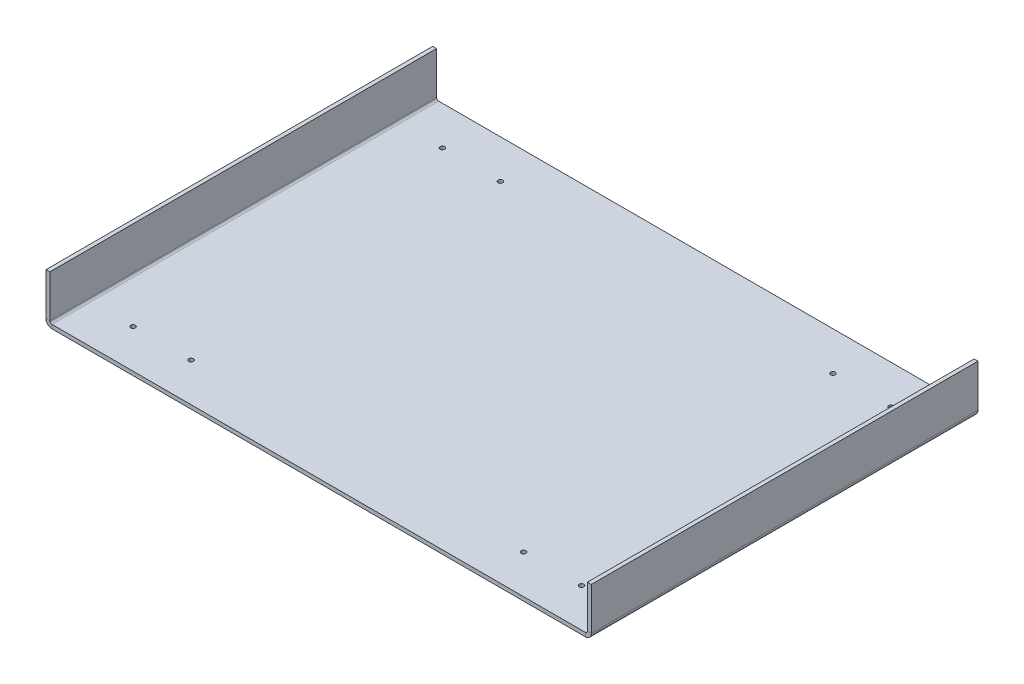
ISO-10303-21;
HEADER;
FILE_DESCRIPTION(('STEP AP214'),'2;1');
FILE_NAME('part.step','',(''),(''),'','','');
FILE_SCHEMA(('AUTOMOTIVE_DESIGN { 1 0 10303 214 1 1 1 1 }'));
ENDSEC;
DATA;
#1=APPLICATION_CONTEXT('core data for automotive mechanical design processes');
#2=APPLICATION_PROTOCOL_DEFINITION('international standard','automotive_design',2000,#1);
#3=PRODUCT_CONTEXT('',#1,'mechanical');
#4=PRODUCT('Part','Part','',(#3));
#5=PRODUCT_RELATED_PRODUCT_CATEGORY('part','',(#4));
#6=PRODUCT_DEFINITION_FORMATION('','',#4);
#7=PRODUCT_DEFINITION_CONTEXT('part definition',#1,'design');
#8=PRODUCT_DEFINITION('design','',#6,#7);
#9=PRODUCT_DEFINITION_SHAPE('','',#8);
#10=(LENGTH_UNIT() NAMED_UNIT(*) SI_UNIT(.MILLI.,.METRE.));
#11=(NAMED_UNIT(*) PLANE_ANGLE_UNIT() SI_UNIT($,.RADIAN.));
#12=(NAMED_UNIT(*) SI_UNIT($,.STERADIAN.) SOLID_ANGLE_UNIT());
#13=UNCERTAINTY_MEASURE_WITH_UNIT(LENGTH_MEASURE(1.E-05),#10,'distance_accuracy_value','');
#14=(GEOMETRIC_REPRESENTATION_CONTEXT(3) GLOBAL_UNCERTAINTY_ASSIGNED_CONTEXT((#13)) GLOBAL_UNIT_ASSIGNED_CONTEXT((#10,
#11,#12)) REPRESENTATION_CONTEXT('',''));
#15=CARTESIAN_POINT('',(0.,0.,0.));
#16=DIRECTION('',(0.,0.,1.));
#17=DIRECTION('',(1.,0.,0.));
#18=AXIS2_PLACEMENT_3D('',#15,#16,#17);
#19=CARTESIAN_POINT('',(0.,-4.,0.));
#20=DIRECTION('',(0.,-1.,0.));
#21=DIRECTION('',(0.,0.,-1.));
#22=AXIS2_PLACEMENT_3D('',#19,#20,#21);
#23=PLANE('',#22);
#24=CARTESIAN_POINT('',(232.,-4.,160.));
#25=DIRECTION('',(0.,-1.,0.));
#26=DIRECTION('',(0.,0.,-1.));
#27=AXIS2_PLACEMENT_3D('',#24,#25,#26);
#28=CIRCLE('',#27,2.4);
#29=CARTESIAN_POINT('',(232.,-4.,157.6));
#30=VERTEX_POINT('',#29);
#31=EDGE_CURVE('E540',#30,#30,#28,.T.);
#32=ORIENTED_EDGE('',*,*,#31,.F.);
#33=EDGE_LOOP('',(#32));
#34=FACE_BOUND('',#33,.T.);
#35=CARTESIAN_POINT('',(172.,-4.,160.));
#36=DIRECTION('',(0.,-1.,0.));
#37=DIRECTION('',(0.,0.,-1.));
#38=AXIS2_PLACEMENT_3D('',#35,#36,#37);
#39=CIRCLE('',#38,2.4);
#40=CARTESIAN_POINT('',(172.,-4.,157.6));
#41=VERTEX_POINT('',#40);
#42=EDGE_CURVE('E544',#41,#41,#39,.T.);
#43=ORIENTED_EDGE('',*,*,#42,.F.);
#44=EDGE_LOOP('',(#43));
#45=FACE_BOUND('',#44,.T.);
#46=CARTESIAN_POINT('',(-172.,-4.,160.));
#47=DIRECTION('',(0.,-1.,0.));
#48=DIRECTION('',(0.,0.,-1.));
#49=AXIS2_PLACEMENT_3D('',#46,#47,#48);
#50=CIRCLE('',#49,2.4);
#51=CARTESIAN_POINT('',(-172.,-4.,157.6));
#52=VERTEX_POINT('',#51);
#53=EDGE_CURVE('E553',#52,#52,#50,.T.);
#54=ORIENTED_EDGE('',*,*,#53,.F.);
#55=EDGE_LOOP('',(#54));
#56=FACE_BOUND('',#55,.T.);
#57=CARTESIAN_POINT('',(-232.,-4.,160.));
#58=DIRECTION('',(0.,-1.,0.));
#59=DIRECTION('',(0.,0.,-1.));
#60=AXIS2_PLACEMENT_3D('',#57,#58,#59);
#61=CIRCLE('',#60,2.4);
#62=CARTESIAN_POINT('',(-232.,-4.,157.6));
#63=VERTEX_POINT('',#62);
#64=EDGE_CURVE('E559',#63,#63,#61,.T.);
#65=ORIENTED_EDGE('',*,*,#64,.F.);
#66=EDGE_LOOP('',(#65));
#67=FACE_BOUND('',#66,.T.);
#68=CARTESIAN_POINT('',(232.,-4.,-160.));
#69=DIRECTION('',(0.,-1.,0.));
#70=DIRECTION('',(0.,0.,-1.));
#71=AXIS2_PLACEMENT_3D('',#68,#69,#70);
#72=CIRCLE('',#71,2.4);
#73=CARTESIAN_POINT('',(232.,-4.,-162.4));
#74=VERTEX_POINT('',#73);
#75=EDGE_CURVE('E565',#74,#74,#72,.T.);
#76=ORIENTED_EDGE('',*,*,#75,.F.);
#77=EDGE_LOOP('',(#76));
#78=FACE_BOUND('',#77,.T.);
#79=CARTESIAN_POINT('',(172.,-4.,-160.));
#80=DIRECTION('',(0.,-1.,0.));
#81=DIRECTION('',(0.,0.,-1.));
#82=AXIS2_PLACEMENT_3D('',#79,#80,#81);
#83=CIRCLE('',#82,2.4);
#84=CARTESIAN_POINT('',(172.,-4.,-162.4));
#85=VERTEX_POINT('',#84);
#86=EDGE_CURVE('E571',#85,#85,#83,.T.);
#87=ORIENTED_EDGE('',*,*,#86,.F.);
#88=EDGE_LOOP('',(#87));
#89=FACE_BOUND('',#88,.T.);
#90=CARTESIAN_POINT('',(-172.,-4.,-160.));
#91=DIRECTION('',(0.,-1.,0.));
#92=DIRECTION('',(0.,0.,-1.));
#93=AXIS2_PLACEMENT_3D('',#90,#91,#92);
#94=CIRCLE('',#93,2.4);
#95=CARTESIAN_POINT('',(-172.,-4.,-162.4));
#96=VERTEX_POINT('',#95);
#97=EDGE_CURVE('E577',#96,#96,#94,.T.);
#98=ORIENTED_EDGE('',*,*,#97,.F.);
#99=EDGE_LOOP('',(#98));
#100=FACE_BOUND('',#99,.T.);
#101=CARTESIAN_POINT('',(-232.,-4.,-160.));
#102=DIRECTION('',(0.,-1.,0.));
#103=DIRECTION('',(0.,0.,-1.));
#104=AXIS2_PLACEMENT_3D('',#101,#102,#103);
#105=CIRCLE('',#104,2.4);
#106=CARTESIAN_POINT('',(-232.,-4.,-162.4));
#107=VERTEX_POINT('',#106);
#108=EDGE_CURVE('E583',#107,#107,#105,.T.);
#109=ORIENTED_EDGE('',*,*,#108,.F.);
#110=EDGE_LOOP('',(#109));
#111=FACE_BOUND('',#110,.T.);
#112=DIRECTION('',(-1.,0.,0.));
#113=VECTOR('',#112,1.);
#114=CARTESIAN_POINT('',(-282.,-4.,-200.));
#115=LINE('',#114,#113);
#116=CARTESIAN_POINT('',(276.,-4.,-200.));
#117=VERTEX_POINT('',#116);
#118=CARTESIAN_POINT('',(-276.,-4.,-200.));
#119=VERTEX_POINT('',#118);
#120=EDGE_CURVE('E26',#117,#119,#115,.T.);
#121=ORIENTED_EDGE('',*,*,#120,.F.);
#122=DIRECTION('',(0.,0.,-1.));
#123=VECTOR('',#122,1.);
#124=CARTESIAN_POINT('',(276.,-4.,-200.));
#125=LINE('',#124,#123);
#126=CARTESIAN_POINT('',(276.,-4.,200.));
#127=VERTEX_POINT('',#126);
#128=EDGE_CURVE('E150',#117,#127,#125,.F.);
#129=ORIENTED_EDGE('',*,*,#128,.T.);
#130=DIRECTION('',(1.,0.,0.));
#131=VECTOR('',#130,1.);
#132=CARTESIAN_POINT('',(-282.,-4.,200.));
#133=LINE('',#132,#131);
#134=CARTESIAN_POINT('',(-276.,-4.,200.));
#135=VERTEX_POINT('',#134);
#136=EDGE_CURVE('E11',#135,#127,#133,.T.);
#137=ORIENTED_EDGE('',*,*,#136,.F.);
#138=DIRECTION('',(0.,0.,1.));
#139=VECTOR('',#138,1.);
#140=CARTESIAN_POINT('',(-276.,-4.,200.));
#141=LINE('',#140,#139);
#142=EDGE_CURVE('E201',#135,#119,#141,.F.);
#143=ORIENTED_EDGE('',*,*,#142,.T.);
#144=EDGE_LOOP('',(#121,#129,#137,#143));
#145=FACE_BOUND('',#144,.T.);
#146=ADVANCED_FACE('F17',(#34,#45,#56,#67,#78,#89,#100,#111,#145),#23,.T.);
#147=CARTESIAN_POINT('',(0.,0.,0.));
#148=DIRECTION('',(0.,-1.,0.));
#149=DIRECTION('',(0.,0.,-1.));
#150=AXIS2_PLACEMENT_3D('',#147,#148,#149);
#151=PLANE('',#150);
#152=CARTESIAN_POINT('',(232.,0.,160.));
#153=DIRECTION('',(0.,-1.,0.));
#154=DIRECTION('',(0.,0.,-1.));
#155=AXIS2_PLACEMENT_3D('',#152,#153,#154);
#156=CIRCLE('',#155,2.4);
#157=CARTESIAN_POINT('',(232.,0.,157.6));
#158=VERTEX_POINT('',#157);
#159=EDGE_CURVE('E543',#158,#158,#156,.T.);
#160=ORIENTED_EDGE('',*,*,#159,.T.);
#161=EDGE_LOOP('',(#160));
#162=FACE_BOUND('',#161,.T.);
#163=CARTESIAN_POINT('',(172.,0.,160.));
#164=DIRECTION('',(0.,-1.,0.));
#165=DIRECTION('',(0.,0.,-1.));
#166=AXIS2_PLACEMENT_3D('',#163,#164,#165);
#167=CIRCLE('',#166,2.4);
#168=CARTESIAN_POINT('',(172.,0.,157.6));
#169=VERTEX_POINT('',#168);
#170=EDGE_CURVE('E547',#169,#169,#167,.T.);
#171=ORIENTED_EDGE('',*,*,#170,.T.);
#172=EDGE_LOOP('',(#171));
#173=FACE_BOUND('',#172,.T.);
#174=CARTESIAN_POINT('',(-172.,0.,160.));
#175=DIRECTION('',(0.,-1.,0.));
#176=DIRECTION('',(0.,0.,-1.));
#177=AXIS2_PLACEMENT_3D('',#174,#175,#176);
#178=CIRCLE('',#177,2.4);
#179=CARTESIAN_POINT('',(-172.,0.,157.6));
#180=VERTEX_POINT('',#179);
#181=EDGE_CURVE('E556',#180,#180,#178,.T.);
#182=ORIENTED_EDGE('',*,*,#181,.T.);
#183=EDGE_LOOP('',(#182));
#184=FACE_BOUND('',#183,.T.);
#185=CARTESIAN_POINT('',(-232.,0.,160.));
#186=DIRECTION('',(0.,-1.,0.));
#187=DIRECTION('',(0.,0.,-1.));
#188=AXIS2_PLACEMENT_3D('',#185,#186,#187);
#189=CIRCLE('',#188,2.4);
#190=CARTESIAN_POINT('',(-232.,0.,157.6));
#191=VERTEX_POINT('',#190);
#192=EDGE_CURVE('E562',#191,#191,#189,.T.);
#193=ORIENTED_EDGE('',*,*,#192,.T.);
#194=EDGE_LOOP('',(#193));
#195=FACE_BOUND('',#194,.T.);
#196=CARTESIAN_POINT('',(232.,0.,-160.));
#197=DIRECTION('',(0.,-1.,0.));
#198=DIRECTION('',(0.,0.,-1.));
#199=AXIS2_PLACEMENT_3D('',#196,#197,#198);
#200=CIRCLE('',#199,2.4);
#201=CARTESIAN_POINT('',(232.,0.,-162.4));
#202=VERTEX_POINT('',#201);
#203=EDGE_CURVE('E568',#202,#202,#200,.T.);
#204=ORIENTED_EDGE('',*,*,#203,.T.);
#205=EDGE_LOOP('',(#204));
#206=FACE_BOUND('',#205,.T.);
#207=CARTESIAN_POINT('',(172.,0.,-160.));
#208=DIRECTION('',(0.,-1.,0.));
#209=DIRECTION('',(0.,0.,-1.));
#210=AXIS2_PLACEMENT_3D('',#207,#208,#209);
#211=CIRCLE('',#210,2.4);
#212=CARTESIAN_POINT('',(172.,0.,-162.4));
#213=VERTEX_POINT('',#212);
#214=EDGE_CURVE('E574',#213,#213,#211,.T.);
#215=ORIENTED_EDGE('',*,*,#214,.T.);
#216=EDGE_LOOP('',(#215));
#217=FACE_BOUND('',#216,.T.);
#218=CARTESIAN_POINT('',(-172.,0.,-160.));
#219=DIRECTION('',(0.,-1.,0.));
#220=DIRECTION('',(0.,0.,-1.));
#221=AXIS2_PLACEMENT_3D('',#218,#219,#220);
#222=CIRCLE('',#221,2.4);
#223=CARTESIAN_POINT('',(-172.,0.,-162.4));
#224=VERTEX_POINT('',#223);
#225=EDGE_CURVE('E580',#224,#224,#222,.T.);
#226=ORIENTED_EDGE('',*,*,#225,.T.);
#227=EDGE_LOOP('',(#226));
#228=FACE_BOUND('',#227,.T.);
#229=CARTESIAN_POINT('',(-232.,0.,-160.));
#230=DIRECTION('',(0.,-1.,0.));
#231=DIRECTION('',(0.,0.,-1.));
#232=AXIS2_PLACEMENT_3D('',#229,#230,#231);
#233=CIRCLE('',#232,2.4);
#234=CARTESIAN_POINT('',(-232.,0.,-162.4));
#235=VERTEX_POINT('',#234);
#236=EDGE_CURVE('E149',#235,#235,#233,.T.);
#237=ORIENTED_EDGE('',*,*,#236,.T.);
#238=EDGE_LOOP('',(#237));
#239=FACE_BOUND('',#238,.T.);
#240=DIRECTION('',(0.,0.,-1.));
#241=VECTOR('',#240,1.);
#242=CARTESIAN_POINT('',(276.,0.,-200.));
#243=LINE('',#242,#241);
#244=CARTESIAN_POINT('',(276.,0.,-200.));
#245=VERTEX_POINT('',#244);
#246=CARTESIAN_POINT('',(276.,0.,200.));
#247=VERTEX_POINT('',#246);
#248=EDGE_CURVE('E161',#245,#247,#243,.F.);
#249=ORIENTED_EDGE('',*,*,#248,.F.);
#250=DIRECTION('',(-1.,0.,0.));
#251=VECTOR('',#250,1.);
#252=CARTESIAN_POINT('',(-282.,0.,-200.));
#253=LINE('',#252,#251);
#254=CARTESIAN_POINT('',(-276.,0.,-200.));
#255=VERTEX_POINT('',#254);
#256=EDGE_CURVE('E218',#245,#255,#253,.T.);
#257=ORIENTED_EDGE('',*,*,#256,.T.);
#258=DIRECTION('',(0.,0.,1.));
#259=VECTOR('',#258,1.);
#260=CARTESIAN_POINT('',(-276.,0.,200.));
#261=LINE('',#260,#259);
#262=CARTESIAN_POINT('',(-276.,0.,200.));
#263=VERTEX_POINT('',#262);
#264=EDGE_CURVE('E212',#263,#255,#261,.F.);
#265=ORIENTED_EDGE('',*,*,#264,.F.);
#266=DIRECTION('',(1.,0.,0.));
#267=VECTOR('',#266,1.);
#268=CARTESIAN_POINT('',(-282.,0.,200.));
#269=LINE('',#268,#267);
#270=EDGE_CURVE('E21',#263,#247,#269,.T.);
#271=ORIENTED_EDGE('',*,*,#270,.T.);
#272=EDGE_LOOP('',(#249,#257,#265,#271));
#273=FACE_BOUND('',#272,.T.);
#274=ADVANCED_FACE('F230',(#162,#173,#184,#195,#206,#217,#228,#239,#273),#151,.F.);
#275=CARTESIAN_POINT('',(-282.,-4.,-200.));
#276=DIRECTION('',(0.,0.,-1.));
#277=DIRECTION('',(-1.,0.,0.));
#278=AXIS2_PLACEMENT_3D('',#275,#276,#277);
#279=PLANE('',#278);
#280=ORIENTED_EDGE('',*,*,#256,.F.);
#281=DIRECTION('',(0.,-1.,0.));
#282=VECTOR('',#281,1.);
#283=CARTESIAN_POINT('',(276.,0.,-200.));
#284=LINE('',#283,#282);
#285=EDGE_CURVE('E155',#245,#117,#284,.T.);
#286=ORIENTED_EDGE('',*,*,#285,.T.);
#287=ORIENTED_EDGE('',*,*,#120,.T.);
#288=DIRECTION('',(0.,-1.,0.));
#289=VECTOR('',#288,1.);
#290=CARTESIAN_POINT('',(-276.,0.,-200.));
#291=LINE('',#290,#289);
#292=EDGE_CURVE('E216',#255,#119,#291,.T.);
#293=ORIENTED_EDGE('',*,*,#292,.F.);
#294=EDGE_LOOP('',(#280,#286,#287,#293));
#295=FACE_BOUND('',#294,.T.);
#296=ADVANCED_FACE('F19',(#295),#279,.T.);
#297=CARTESIAN_POINT('',(-282.,-4.,200.));
#298=DIRECTION('',(0.,0.,1.));
#299=DIRECTION('',(1.,0.,0.));
#300=AXIS2_PLACEMENT_3D('',#297,#298,#299);
#301=PLANE('',#300);
#302=DIRECTION('',(0.,-1.,0.));
#303=VECTOR('',#302,1.);
#304=CARTESIAN_POINT('',(276.,0.,200.));
#305=LINE('',#304,#303);
#306=EDGE_CURVE('E166',#247,#127,#305,.T.);
#307=ORIENTED_EDGE('',*,*,#306,.F.);
#308=ORIENTED_EDGE('',*,*,#270,.F.);
#309=DIRECTION('',(0.,-1.,0.));
#310=VECTOR('',#309,1.);
#311=CARTESIAN_POINT('',(-276.,0.,200.));
#312=LINE('',#311,#310);
#313=EDGE_CURVE('E206',#263,#135,#312,.T.);
#314=ORIENTED_EDGE('',*,*,#313,.T.);
#315=ORIENTED_EDGE('',*,*,#136,.T.);
#316=EDGE_LOOP('',(#307,#308,#314,#315));
#317=FACE_BOUND('',#316,.T.);
#318=ADVANCED_FACE('F233',(#317),#301,.T.);
#319=CARTESIAN_POINT('',(-276.,2.,-200.));
#320=DIRECTION('',(0.,0.,-1.));
#321=DIRECTION('',(-1.,0.,0.));
#322=AXIS2_PLACEMENT_3D('',#319,#320,#321);
#323=PLANE('',#322);
#324=DIRECTION('',(1.,0.,0.));
#325=VECTOR('',#324,1.);
#326=CARTESIAN_POINT('',(-282.,2.,-200.));
#327=LINE('',#326,#325);
#328=CARTESIAN_POINT('',(-278.,2.,-200.));
#329=VERTEX_POINT('',#328);
#330=CARTESIAN_POINT('',(-282.,2.,-200.));
#331=VERTEX_POINT('',#330);
#332=EDGE_CURVE('E168',#329,#331,#327,.F.);
#333=ORIENTED_EDGE('',*,*,#332,.F.);
#334=CARTESIAN_POINT('',(-276.,2.,-200.));
#335=DIRECTION('',(0.,0.,1.));
#336=DIRECTION('',(1.,0.,0.));
#337=AXIS2_PLACEMENT_3D('',#334,#335,#336);
#338=CIRCLE('',#337,2.);
#339=EDGE_CURVE('E209',#255,#329,#338,.F.);
#340=ORIENTED_EDGE('',*,*,#339,.F.);
#341=ORIENTED_EDGE('',*,*,#292,.T.);
#342=CARTESIAN_POINT('',(-276.,2.,-200.));
#343=DIRECTION('',(0.,0.,1.));
#344=DIRECTION('',(1.,0.,0.));
#345=AXIS2_PLACEMENT_3D('',#342,#343,#344);
#346=CIRCLE('',#345,6.);
#347=EDGE_CURVE('E34',#119,#331,#346,.F.);
#348=ORIENTED_EDGE('',*,*,#347,.T.);
#349=EDGE_LOOP('',(#333,#340,#341,#348));
#350=FACE_BOUND('',#349,.T.);
#351=ADVANCED_FACE('F248',(#350),#323,.T.);
#352=CARTESIAN_POINT('',(-276.,2.,200.));
#353=DIRECTION('',(0.,0.,-1.));
#354=DIRECTION('',(-1.,0.,0.));
#355=AXIS2_PLACEMENT_3D('',#352,#353,#354);
#356=PLANE('',#355);
#357=CARTESIAN_POINT('',(-276.,2.,200.));
#358=DIRECTION('',(0.,0.,1.));
#359=DIRECTION('',(1.,0.,0.));
#360=AXIS2_PLACEMENT_3D('',#357,#358,#359);
#361=CIRCLE('',#360,2.);
#362=CARTESIAN_POINT('',(-278.,2.,200.));
#363=VERTEX_POINT('',#362);
#364=EDGE_CURVE('E174',#363,#263,#361,.T.);
#365=ORIENTED_EDGE('',*,*,#364,.F.);
#366=DIRECTION('',(1.,0.,0.));
#367=VECTOR('',#366,1.);
#368=CARTESIAN_POINT('',(-278.,2.,200.));
#369=LINE('',#368,#367);
#370=CARTESIAN_POINT('',(-282.,2.,200.));
#371=VERTEX_POINT('',#370);
#372=EDGE_CURVE('E194',#363,#371,#369,.F.);
#373=ORIENTED_EDGE('',*,*,#372,.T.);
#374=CARTESIAN_POINT('',(-276.,2.,200.));
#375=DIRECTION('',(0.,0.,1.));
#376=DIRECTION('',(1.,0.,0.));
#377=AXIS2_PLACEMENT_3D('',#374,#375,#376);
#378=CIRCLE('',#377,6.);
#379=EDGE_CURVE('E204',#371,#135,#378,.T.);
#380=ORIENTED_EDGE('',*,*,#379,.T.);
#381=ORIENTED_EDGE('',*,*,#313,.F.);
#382=EDGE_LOOP('',(#365,#373,#380,#381));
#383=FACE_BOUND('',#382,.T.);
#384=ADVANCED_FACE('F272',(#383),#356,.F.);
#385=CARTESIAN_POINT('',(-276.,2.,200.));
#386=DIRECTION('',(0.,0.,1.));
#387=DIRECTION('',(-1.,0.,0.));
#388=AXIS2_PLACEMENT_3D('',#385,#386,#387);
#389=CYLINDRICAL_SURFACE('',#388,6.);
#390=ORIENTED_EDGE('',*,*,#142,.F.);
#391=ORIENTED_EDGE('',*,*,#379,.F.);
#392=DIRECTION('',(0.,0.,1.));
#393=VECTOR('',#392,1.);
#394=CARTESIAN_POINT('',(-282.,2.,-200.));
#395=LINE('',#394,#393);
#396=EDGE_CURVE('E192',#371,#331,#395,.F.);
#397=ORIENTED_EDGE('',*,*,#396,.T.);
#398=ORIENTED_EDGE('',*,*,#347,.F.);
#399=EDGE_LOOP('',(#390,#391,#397,#398));
#400=FACE_BOUND('',#399,.T.);
#401=ADVANCED_FACE('F275',(#400),#389,.T.);
#402=CARTESIAN_POINT('',(-276.,2.,200.));
#403=DIRECTION('',(0.,0.,1.));
#404=DIRECTION('',(-1.,0.,0.));
#405=AXIS2_PLACEMENT_3D('',#402,#403,#404);
#406=CYLINDRICAL_SURFACE('',#405,2.);
#407=ORIENTED_EDGE('',*,*,#264,.T.);
#408=ORIENTED_EDGE('',*,*,#339,.T.);
#409=DIRECTION('',(0.,0.,1.));
#410=VECTOR('',#409,1.);
#411=CARTESIAN_POINT('',(-278.,2.,-200.));
#412=LINE('',#411,#410);
#413=EDGE_CURVE('E197',#329,#363,#412,.T.);
#414=ORIENTED_EDGE('',*,*,#413,.T.);
#415=ORIENTED_EDGE('',*,*,#364,.T.);
#416=EDGE_LOOP('',(#407,#408,#414,#415));
#417=FACE_BOUND('',#416,.T.);
#418=ADVANCED_FACE('F251',(#417),#406,.F.);
#419=CARTESIAN_POINT('',(-282.,46.,200.));
#420=DIRECTION('',(0.,0.,-1.));
#421=DIRECTION('',(0.,1.,0.));
#422=AXIS2_PLACEMENT_3D('',#419,#420,#421);
#423=PLANE('',#422);
#424=ORIENTED_EDGE('',*,*,#372,.F.);
#425=DIRECTION('',(0.,-1.,0.));
#426=VECTOR('',#425,1.);
#427=CARTESIAN_POINT('',(-278.,46.,200.));
#428=LINE('',#427,#426);
#429=CARTESIAN_POINT('',(-278.,46.,200.));
#430=VERTEX_POINT('',#429);
#431=EDGE_CURVE('E190',#363,#430,#428,.F.);
#432=ORIENTED_EDGE('',*,*,#431,.T.);
#433=DIRECTION('',(1.,0.,0.));
#434=VECTOR('',#433,1.);
#435=CARTESIAN_POINT('',(-282.,46.,200.));
#436=LINE('',#435,#434);
#437=CARTESIAN_POINT('',(-282.,46.,200.));
#438=VERTEX_POINT('',#437);
#439=EDGE_CURVE('E171',#438,#430,#436,.T.);
#440=ORIENTED_EDGE('',*,*,#439,.F.);
#441=DIRECTION('',(0.,1.,0.));
#442=VECTOR('',#441,1.);
#443=CARTESIAN_POINT('',(-282.,-1.15556481806776E-12,200.));
#444=LINE('',#443,#442);
#445=EDGE_CURVE('E183',#371,#438,#444,.T.);
#446=ORIENTED_EDGE('',*,*,#445,.F.);
#447=EDGE_LOOP('',(#424,#432,#440,#446));
#448=FACE_BOUND('',#447,.T.);
#449=ADVANCED_FACE('F269',(#448),#423,.F.);
#450=CARTESIAN_POINT('',(-282.,0.,-200.));
#451=DIRECTION('',(0.,0.,1.));
#452=DIRECTION('',(0.,-1.,0.));
#453=AXIS2_PLACEMENT_3D('',#450,#451,#452);
#454=PLANE('',#453);
#455=ORIENTED_EDGE('',*,*,#332,.T.);
#456=DIRECTION('',(0.,-1.,0.));
#457=VECTOR('',#456,1.);
#458=CARTESIAN_POINT('',(-282.,-9.1421198662751E-13,-200.));
#459=LINE('',#458,#457);
#460=CARTESIAN_POINT('',(-282.,46.,-200.));
#461=VERTEX_POINT('',#460);
#462=EDGE_CURVE('E178',#461,#331,#459,.T.);
#463=ORIENTED_EDGE('',*,*,#462,.F.);
#464=DIRECTION('',(1.,0.,0.));
#465=VECTOR('',#464,1.);
#466=CARTESIAN_POINT('',(-282.,46.,-200.));
#467=LINE('',#466,#465);
#468=CARTESIAN_POINT('',(-278.,46.,-200.));
#469=VERTEX_POINT('',#468);
#470=EDGE_CURVE('E175',#461,#469,#467,.T.);
#471=ORIENTED_EDGE('',*,*,#470,.T.);
#472=DIRECTION('',(0.,1.,0.));
#473=VECTOR('',#472,1.);
#474=CARTESIAN_POINT('',(-278.,0.,-200.));
#475=LINE('',#474,#473);
#476=EDGE_CURVE('E185',#469,#329,#475,.F.);
#477=ORIENTED_EDGE('',*,*,#476,.T.);
#478=EDGE_LOOP('',(#455,#463,#471,#477));
#479=FACE_BOUND('',#478,.T.);
#480=ADVANCED_FACE('F259',(#479),#454,.F.);
#481=CARTESIAN_POINT('',(-282.,-1.03488840234764E-12,0.));
#482=DIRECTION('',(1.,0.,0.));
#483=DIRECTION('',(0.,1.,0.));
#484=AXIS2_PLACEMENT_3D('',#481,#482,#483);
#485=PLANE('',#484);
#486=ORIENTED_EDGE('',*,*,#396,.F.);
#487=ORIENTED_EDGE('',*,*,#445,.T.);
#488=DIRECTION('',(0.,0.,-1.));
#489=VECTOR('',#488,1.);
#490=CARTESIAN_POINT('',(-282.,46.,0.));
#491=LINE('',#490,#489);
#492=EDGE_CURVE('E181',#438,#461,#491,.T.);
#493=ORIENTED_EDGE('',*,*,#492,.T.);
#494=ORIENTED_EDGE('',*,*,#462,.T.);
#495=EDGE_LOOP('',(#486,#487,#493,#494));
#496=FACE_BOUND('',#495,.T.);
#497=ADVANCED_FACE('F274',(#496),#485,.F.);
#498=CARTESIAN_POINT('',(-278.,-1.02092247699226E-12,0.));
#499=DIRECTION('',(1.,0.,0.));
#500=DIRECTION('',(0.,1.,0.));
#501=AXIS2_PLACEMENT_3D('',#498,#499,#500);
#502=PLANE('',#501);
#503=ORIENTED_EDGE('',*,*,#431,.F.);
#504=ORIENTED_EDGE('',*,*,#413,.F.);
#505=ORIENTED_EDGE('',*,*,#476,.F.);
#506=DIRECTION('',(0.,0.,1.));
#507=VECTOR('',#506,1.);
#508=CARTESIAN_POINT('',(-278.,46.,-200.));
#509=LINE('',#508,#507);
#510=EDGE_CURVE('E188',#430,#469,#509,.F.);
#511=ORIENTED_EDGE('',*,*,#510,.F.);
#512=EDGE_LOOP('',(#503,#504,#505,#511));
#513=FACE_BOUND('',#512,.T.);
#514=ADVANCED_FACE('F256',(#513),#502,.T.);
#515=CARTESIAN_POINT('',(-282.,46.,-200.));
#516=DIRECTION('',(0.,-1.,0.));
#517=DIRECTION('',(1.,0.,0.));
#518=AXIS2_PLACEMENT_3D('',#515,#516,#517);
#519=PLANE('',#518);
#520=ORIENTED_EDGE('',*,*,#510,.T.);
#521=ORIENTED_EDGE('',*,*,#470,.F.);
#522=ORIENTED_EDGE('',*,*,#492,.F.);
#523=ORIENTED_EDGE('',*,*,#439,.T.);
#524=EDGE_LOOP('',(#520,#521,#522,#523));
#525=FACE_BOUND('',#524,.T.);
#526=ADVANCED_FACE('F264',(#525),#519,.F.);
#527=CARTESIAN_POINT('',(276.,2.,200.));
#528=DIRECTION('',(0.,0.,1.));
#529=DIRECTION('',(1.,0.,0.));
#530=AXIS2_PLACEMENT_3D('',#527,#528,#529);
#531=PLANE('',#530);
#532=DIRECTION('',(-1.,0.,0.));
#533=VECTOR('',#532,1.);
#534=CARTESIAN_POINT('',(282.,2.,200.));
#535=LINE('',#534,#533);
#536=CARTESIAN_POINT('',(278.,2.,200.));
#537=VERTEX_POINT('',#536);
#538=CARTESIAN_POINT('',(282.,2.,200.));
#539=VERTEX_POINT('',#538);
#540=EDGE_CURVE('E132',#537,#539,#535,.F.);
#541=ORIENTED_EDGE('',*,*,#540,.F.);
#542=CARTESIAN_POINT('',(276.,2.,200.));
#543=DIRECTION('',(0.,0.,-1.));
#544=DIRECTION('',(-1.,0.,0.));
#545=AXIS2_PLACEMENT_3D('',#542,#543,#544);
#546=CIRCLE('',#545,2.);
#547=EDGE_CURVE('E158',#247,#537,#546,.F.);
#548=ORIENTED_EDGE('',*,*,#547,.F.);
#549=ORIENTED_EDGE('',*,*,#306,.T.);
#550=CARTESIAN_POINT('',(276.,2.,200.));
#551=DIRECTION('',(0.,0.,-1.));
#552=DIRECTION('',(-1.,0.,0.));
#553=AXIS2_PLACEMENT_3D('',#550,#551,#552);
#554=CIRCLE('',#553,6.);
#555=EDGE_CURVE('E42',#127,#539,#554,.F.);
#556=ORIENTED_EDGE('',*,*,#555,.T.);
#557=EDGE_LOOP('',(#541,#548,#549,#556));
#558=FACE_BOUND('',#557,.T.);
#559=ADVANCED_FACE('F237',(#558),#531,.T.);
#560=CARTESIAN_POINT('',(276.,2.,-200.));
#561=DIRECTION('',(0.,0.,1.));
#562=DIRECTION('',(1.,0.,0.));
#563=AXIS2_PLACEMENT_3D('',#560,#561,#562);
#564=PLANE('',#563);
#565=CARTESIAN_POINT('',(276.,2.,-200.));
#566=DIRECTION('',(0.,0.,-1.));
#567=DIRECTION('',(-1.,0.,0.));
#568=AXIS2_PLACEMENT_3D('',#565,#566,#567);
#569=CIRCLE('',#568,2.);
#570=CARTESIAN_POINT('',(278.,2.,-200.));
#571=VERTEX_POINT('',#570);
#572=EDGE_CURVE('E163',#571,#245,#569,.T.);
#573=ORIENTED_EDGE('',*,*,#572,.F.);
#574=DIRECTION('',(-1.,0.,0.));
#575=VECTOR('',#574,1.);
#576=CARTESIAN_POINT('',(278.,2.,-200.));
#577=LINE('',#576,#575);
#578=CARTESIAN_POINT('',(282.,2.,-200.));
#579=VERTEX_POINT('',#578);
#580=EDGE_CURVE('E143',#571,#579,#577,.F.);
#581=ORIENTED_EDGE('',*,*,#580,.T.);
#582=CARTESIAN_POINT('',(276.,2.,-200.));
#583=DIRECTION('',(0.,0.,-1.));
#584=DIRECTION('',(-1.,0.,0.));
#585=AXIS2_PLACEMENT_3D('',#582,#583,#584);
#586=CIRCLE('',#585,6.);
#587=EDGE_CURVE('E153',#579,#117,#586,.T.);
#588=ORIENTED_EDGE('',*,*,#587,.T.);
#589=ORIENTED_EDGE('',*,*,#285,.F.);
#590=EDGE_LOOP('',(#573,#581,#588,#589));
#591=FACE_BOUND('',#590,.T.);
#592=ADVANCED_FACE('F243',(#591),#564,.F.);
#593=CARTESIAN_POINT('',(276.,2.,-200.));
#594=DIRECTION('',(0.,0.,-1.));
#595=DIRECTION('',(1.,0.,0.));
#596=AXIS2_PLACEMENT_3D('',#593,#594,#595);
#597=CYLINDRICAL_SURFACE('',#596,6.);
#598=ORIENTED_EDGE('',*,*,#128,.F.);
#599=ORIENTED_EDGE('',*,*,#587,.F.);
#600=DIRECTION('',(0.,0.,-1.));
#601=VECTOR('',#600,1.);
#602=CARTESIAN_POINT('',(282.,2.,200.));
#603=LINE('',#602,#601);
#604=EDGE_CURVE('E141',#579,#539,#603,.F.);
#605=ORIENTED_EDGE('',*,*,#604,.T.);
#606=ORIENTED_EDGE('',*,*,#555,.F.);
#607=EDGE_LOOP('',(#598,#599,#605,#606));
#608=FACE_BOUND('',#607,.T.);
#609=ADVANCED_FACE('F240',(#608),#597,.T.);
#610=CARTESIAN_POINT('',(276.,2.,-200.));
#611=DIRECTION('',(0.,0.,-1.));
#612=DIRECTION('',(1.,0.,0.));
#613=AXIS2_PLACEMENT_3D('',#610,#611,#612);
#614=CYLINDRICAL_SURFACE('',#613,2.);
#615=ORIENTED_EDGE('',*,*,#248,.T.);
#616=ORIENTED_EDGE('',*,*,#547,.T.);
#617=DIRECTION('',(0.,0.,-1.));
#618=VECTOR('',#617,1.);
#619=CARTESIAN_POINT('',(278.,2.,200.));
#620=LINE('',#619,#618);
#621=EDGE_CURVE('E146',#537,#571,#620,.T.);
#622=ORIENTED_EDGE('',*,*,#621,.T.);
#623=ORIENTED_EDGE('',*,*,#572,.T.);
#624=EDGE_LOOP('',(#615,#616,#622,#623));
#625=FACE_BOUND('',#624,.T.);
#626=ADVANCED_FACE('F402',(#625),#614,.F.);
#627=CARTESIAN_POINT('',(282.,0.,200.));
#628=DIRECTION('',(0.,0.,-1.));
#629=DIRECTION('',(0.,1.,0.));
#630=AXIS2_PLACEMENT_3D('',#627,#628,#629);
#631=PLANE('',#630);
#632=ORIENTED_EDGE('',*,*,#540,.T.);
#633=DIRECTION('',(0.,-1.,0.));
#634=VECTOR('',#633,1.);
#635=CARTESIAN_POINT('',(282.,-1.15556481806776E-12,200.));
#636=LINE('',#635,#634);
#637=CARTESIAN_POINT('',(282.,46.,200.));
#638=VERTEX_POINT('',#637);
#639=EDGE_CURVE('E113',#638,#539,#636,.T.);
#640=ORIENTED_EDGE('',*,*,#639,.F.);
#641=DIRECTION('',(-1.,0.,0.));
#642=VECTOR('',#641,1.);
#643=CARTESIAN_POINT('',(282.,46.,200.));
#644=LINE('',#643,#642);
#645=CARTESIAN_POINT('',(278.,46.,200.));
#646=VERTEX_POINT('',#645);
#647=EDGE_CURVE('E119',#638,#646,#644,.T.);
#648=ORIENTED_EDGE('',*,*,#647,.T.);
#649=DIRECTION('',(0.,1.,0.));
#650=VECTOR('',#649,1.);
#651=CARTESIAN_POINT('',(278.,0.,200.));
#652=LINE('',#651,#650);
#653=EDGE_CURVE('E139',#646,#537,#652,.F.);
#654=ORIENTED_EDGE('',*,*,#653,.T.);
#655=EDGE_LOOP('',(#632,#640,#648,#654));
#656=FACE_BOUND('',#655,.T.);
#657=ADVANCED_FACE('F131',(#656),#631,.F.);
#658=CARTESIAN_POINT('',(282.,46.,-200.));
#659=DIRECTION('',(0.,0.,1.));
#660=DIRECTION('',(0.,-1.,0.));
#661=AXIS2_PLACEMENT_3D('',#658,#659,#660);
#662=PLANE('',#661);
#663=ORIENTED_EDGE('',*,*,#580,.F.);
#664=DIRECTION('',(0.,-1.,0.));
#665=VECTOR('',#664,1.);
#666=CARTESIAN_POINT('',(278.,46.,-200.));
#667=LINE('',#666,#665);
#668=CARTESIAN_POINT('',(278.,46.,-200.));
#669=VERTEX_POINT('',#668);
#670=EDGE_CURVE('E135',#571,#669,#667,.F.);
#671=ORIENTED_EDGE('',*,*,#670,.T.);
#672=DIRECTION('',(-1.,0.,0.));
#673=VECTOR('',#672,1.);
#674=CARTESIAN_POINT('',(282.,46.,-200.));
#675=LINE('',#674,#673);
#676=CARTESIAN_POINT('',(282.,46.,-200.));
#677=VERTEX_POINT('',#676);
#678=EDGE_CURVE('E128',#677,#669,#675,.T.);
#679=ORIENTED_EDGE('',*,*,#678,.F.);
#680=DIRECTION('',(0.,1.,0.));
#681=VECTOR('',#680,1.);
#682=CARTESIAN_POINT('',(282.,-9.1421198662751E-13,-200.));
#683=LINE('',#682,#681);
#684=EDGE_CURVE('E115',#579,#677,#683,.T.);
#685=ORIENTED_EDGE('',*,*,#684,.F.);
#686=EDGE_LOOP('',(#663,#671,#679,#685));
#687=FACE_BOUND('',#686,.T.);
#688=ADVANCED_FACE('F419',(#687),#662,.F.);
#689=CARTESIAN_POINT('',(282.,-1.03488840234764E-12,0.));
#690=DIRECTION('',(-1.,0.,0.));
#691=DIRECTION('',(0.,-1.,0.));
#692=AXIS2_PLACEMENT_3D('',#689,#690,#691);
#693=PLANE('',#692);
#694=ORIENTED_EDGE('',*,*,#604,.F.);
#695=ORIENTED_EDGE('',*,*,#684,.T.);
#696=DIRECTION('',(0.,0.,1.));
#697=VECTOR('',#696,1.);
#698=CARTESIAN_POINT('',(282.,46.,0.));
#699=LINE('',#698,#697);
#700=EDGE_CURVE('E108',#677,#638,#699,.T.);
#701=ORIENTED_EDGE('',*,*,#700,.T.);
#702=ORIENTED_EDGE('',*,*,#639,.T.);
#703=EDGE_LOOP('',(#694,#695,#701,#702));
#704=FACE_BOUND('',#703,.T.);
#705=ADVANCED_FACE('F111',(#704),#693,.F.);
#706=CARTESIAN_POINT('',(278.,-1.02092247699226E-12,0.));
#707=DIRECTION('',(-1.,0.,0.));
#708=DIRECTION('',(0.,-1.,0.));
#709=AXIS2_PLACEMENT_3D('',#706,#707,#708);
#710=PLANE('',#709);
#711=ORIENTED_EDGE('',*,*,#670,.F.);
#712=ORIENTED_EDGE('',*,*,#621,.F.);
#713=ORIENTED_EDGE('',*,*,#653,.F.);
#714=DIRECTION('',(0.,0.,-1.));
#715=VECTOR('',#714,1.);
#716=CARTESIAN_POINT('',(278.,46.,200.));
#717=LINE('',#716,#715);
#718=EDGE_CURVE('E124',#669,#646,#717,.F.);
#719=ORIENTED_EDGE('',*,*,#718,.F.);
#720=EDGE_LOOP('',(#711,#712,#713,#719));
#721=FACE_BOUND('',#720,.T.);
#722=ADVANCED_FACE('F438',(#721),#710,.T.);
#723=CARTESIAN_POINT('',(282.,46.,200.));
#724=DIRECTION('',(0.,-1.,0.));
#725=DIRECTION('',(1.,0.,0.));
#726=AXIS2_PLACEMENT_3D('',#723,#724,#725);
#727=PLANE('',#726);
#728=ORIENTED_EDGE('',*,*,#718,.T.);
#729=ORIENTED_EDGE('',*,*,#647,.F.);
#730=ORIENTED_EDGE('',*,*,#700,.F.);
#731=ORIENTED_EDGE('',*,*,#678,.T.);
#732=EDGE_LOOP('',(#728,#729,#730,#731));
#733=FACE_BOUND('',#732,.T.);
#734=ADVANCED_FACE('F122',(#733),#727,.F.);
#735=CARTESIAN_POINT('',(-232.,-4.,-160.));
#736=DIRECTION('',(0.,-1.,0.));
#737=DIRECTION('',(0.,0.,-1.));
#738=AXIS2_PLACEMENT_3D('',#735,#736,#737);
#739=CYLINDRICAL_SURFACE('',#738,2.4);
#740=ORIENTED_EDGE('',*,*,#108,.T.);
#741=EDGE_LOOP('',(#740));
#742=FACE_BOUND('',#741,.T.);
#743=ORIENTED_EDGE('',*,*,#236,.F.);
#744=EDGE_LOOP('',(#743));
#745=FACE_BOUND('',#744,.T.);
#746=ADVANCED_FACE('F456',(#742,#745),#739,.F.);
#747=CARTESIAN_POINT('',(-172.,-4.,-160.));
#748=DIRECTION('',(0.,-1.,0.));
#749=DIRECTION('',(0.,0.,-1.));
#750=AXIS2_PLACEMENT_3D('',#747,#748,#749);
#751=CYLINDRICAL_SURFACE('',#750,2.4);
#752=ORIENTED_EDGE('',*,*,#97,.T.);
#753=EDGE_LOOP('',(#752));
#754=FACE_BOUND('',#753,.T.);
#755=ORIENTED_EDGE('',*,*,#225,.F.);
#756=EDGE_LOOP('',(#755));
#757=FACE_BOUND('',#756,.T.);
#758=ADVANCED_FACE('F464',(#754,#757),#751,.F.);
#759=CARTESIAN_POINT('',(172.,-4.,-160.));
#760=DIRECTION('',(0.,-1.,0.));
#761=DIRECTION('',(0.,0.,-1.));
#762=AXIS2_PLACEMENT_3D('',#759,#760,#761);
#763=CYLINDRICAL_SURFACE('',#762,2.4);
#764=ORIENTED_EDGE('',*,*,#86,.T.);
#765=EDGE_LOOP('',(#764));
#766=FACE_BOUND('',#765,.T.);
#767=ORIENTED_EDGE('',*,*,#214,.F.);
#768=EDGE_LOOP('',(#767));
#769=FACE_BOUND('',#768,.T.);
#770=ADVANCED_FACE('F474',(#766,#769),#763,.F.);
#771=CARTESIAN_POINT('',(232.,-4.,-160.));
#772=DIRECTION('',(0.,-1.,0.));
#773=DIRECTION('',(0.,0.,-1.));
#774=AXIS2_PLACEMENT_3D('',#771,#772,#773);
#775=CYLINDRICAL_SURFACE('',#774,2.4);
#776=ORIENTED_EDGE('',*,*,#75,.T.);
#777=EDGE_LOOP('',(#776));
#778=FACE_BOUND('',#777,.T.);
#779=ORIENTED_EDGE('',*,*,#203,.F.);
#780=EDGE_LOOP('',(#779));
#781=FACE_BOUND('',#780,.T.);
#782=ADVANCED_FACE('F484',(#778,#781),#775,.F.);
#783=CARTESIAN_POINT('',(-232.,-4.,160.));
#784=DIRECTION('',(0.,-1.,0.));
#785=DIRECTION('',(0.,0.,-1.));
#786=AXIS2_PLACEMENT_3D('',#783,#784,#785);
#787=CYLINDRICAL_SURFACE('',#786,2.4);
#788=ORIENTED_EDGE('',*,*,#64,.T.);
#789=EDGE_LOOP('',(#788));
#790=FACE_BOUND('',#789,.T.);
#791=ORIENTED_EDGE('',*,*,#192,.F.);
#792=EDGE_LOOP('',(#791));
#793=FACE_BOUND('',#792,.T.);
#794=ADVANCED_FACE('F494',(#790,#793),#787,.F.);
#795=CARTESIAN_POINT('',(-172.,-4.,160.));
#796=DIRECTION('',(0.,-1.,0.));
#797=DIRECTION('',(0.,0.,-1.));
#798=AXIS2_PLACEMENT_3D('',#795,#796,#797);
#799=CYLINDRICAL_SURFACE('',#798,2.4);
#800=ORIENTED_EDGE('',*,*,#53,.T.);
#801=EDGE_LOOP('',(#800));
#802=FACE_BOUND('',#801,.T.);
#803=ORIENTED_EDGE('',*,*,#181,.F.);
#804=EDGE_LOOP('',(#803));
#805=FACE_BOUND('',#804,.T.);
#806=ADVANCED_FACE('F505',(#802,#805),#799,.F.);
#807=CARTESIAN_POINT('',(172.,-4.,160.));
#808=DIRECTION('',(0.,-1.,0.));
#809=DIRECTION('',(0.,0.,-1.));
#810=AXIS2_PLACEMENT_3D('',#807,#808,#809);
#811=CYLINDRICAL_SURFACE('',#810,2.4);
#812=ORIENTED_EDGE('',*,*,#42,.T.);
#813=EDGE_LOOP('',(#812));
#814=FACE_BOUND('',#813,.T.);
#815=ORIENTED_EDGE('',*,*,#170,.F.);
#816=EDGE_LOOP('',(#815));
#817=FACE_BOUND('',#816,.T.);
#818=ADVANCED_FACE('F515',(#814,#817),#811,.F.);
#819=CARTESIAN_POINT('',(232.,-4.,160.));
#820=DIRECTION('',(0.,-1.,0.));
#821=DIRECTION('',(0.,0.,-1.));
#822=AXIS2_PLACEMENT_3D('',#819,#820,#821);
#823=CYLINDRICAL_SURFACE('',#822,2.4);
#824=ORIENTED_EDGE('',*,*,#31,.T.);
#825=EDGE_LOOP('',(#824));
#826=FACE_BOUND('',#825,.T.);
#827=ORIENTED_EDGE('',*,*,#159,.F.);
#828=EDGE_LOOP('',(#827));
#829=FACE_BOUND('',#828,.T.);
#830=ADVANCED_FACE('F525',(#826,#829),#823,.F.);
#831=CLOSED_SHELL('',(#146,#274,#296,#318,#351,#384,#401,#418,#449,#480,#497,#514,#526,#559,
#592,#609,#626,#657,#688,#705,#722,#734,#746,#758,#770,#782,#794,#806,#818,#830));
#832=MANIFOLD_SOLID_BREP('B1',#831);
#833=ADVANCED_BREP_SHAPE_REPRESENTATION('',(#18,#832),#14);
#834=SHAPE_DEFINITION_REPRESENTATION(#9,#833);
ENDSEC;
END-ISO-10303-21;
